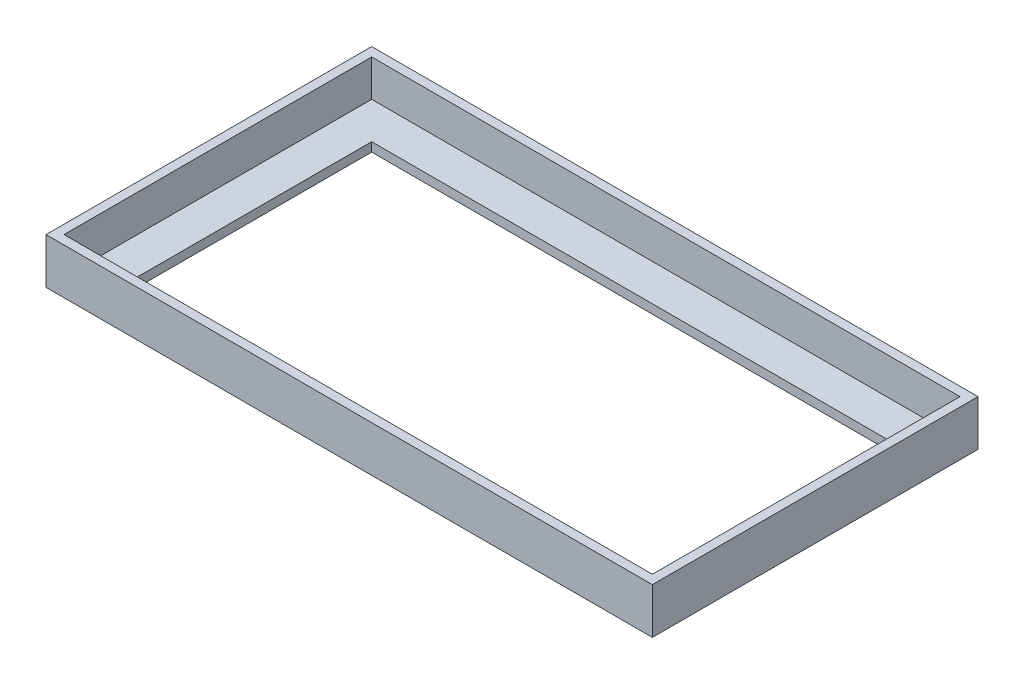
ISO-10303-21;
HEADER;
FILE_DESCRIPTION(('STEP AP214'),'2;1');
FILE_NAME('part.step','',(''),(''),'','','');
FILE_SCHEMA(('AUTOMOTIVE_DESIGN { 1 0 10303 214 1 1 1 1 }'));
ENDSEC;
DATA;
#1=APPLICATION_CONTEXT('core data for automotive mechanical design processes');
#2=APPLICATION_PROTOCOL_DEFINITION('international standard','automotive_design',2000,#1);
#3=PRODUCT_CONTEXT('',#1,'mechanical');
#4=PRODUCT('Part','Part','',(#3));
#5=PRODUCT_RELATED_PRODUCT_CATEGORY('part','',(#4));
#6=PRODUCT_DEFINITION_FORMATION('','',#4);
#7=PRODUCT_DEFINITION_CONTEXT('part definition',#1,'design');
#8=PRODUCT_DEFINITION('design','',#6,#7);
#9=PRODUCT_DEFINITION_SHAPE('','',#8);
#10=(LENGTH_UNIT() NAMED_UNIT(*) SI_UNIT(.MILLI.,.METRE.));
#11=(NAMED_UNIT(*) PLANE_ANGLE_UNIT() SI_UNIT($,.RADIAN.));
#12=(NAMED_UNIT(*) SI_UNIT($,.STERADIAN.) SOLID_ANGLE_UNIT());
#13=UNCERTAINTY_MEASURE_WITH_UNIT(LENGTH_MEASURE(1.E-05),#10,'distance_accuracy_value','');
#14=(GEOMETRIC_REPRESENTATION_CONTEXT(3) GLOBAL_UNCERTAINTY_ASSIGNED_CONTEXT((#13)) GLOBAL_UNIT_ASSIGNED_CONTEXT((#10,
#11,#12)) REPRESENTATION_CONTEXT('',''));
#15=CARTESIAN_POINT('',(0.,0.,0.));
#16=DIRECTION('',(0.,0.,1.));
#17=DIRECTION('',(1.,0.,0.));
#18=AXIS2_PLACEMENT_3D('',#15,#16,#17);
#19=CARTESIAN_POINT('',(168.5,25.4,-90.5));
#20=DIRECTION('',(-1.,0.,0.));
#21=DIRECTION('',(0.,0.,1.));
#22=AXIS2_PLACEMENT_3D('',#19,#20,#21);
#23=PLANE('',#22);
#24=DIRECTION('',(0.,0.,-1.));
#25=VECTOR('',#24,1.);
#26=CARTESIAN_POINT('',(168.5,0.,-90.5));
#27=LINE('',#26,#25);
#28=CARTESIAN_POINT('',(168.5,0.,90.5));
#29=VERTEX_POINT('',#28);
#30=CARTESIAN_POINT('',(168.5,0.,-90.5));
#31=VERTEX_POINT('',#30);
#32=EDGE_CURVE('E177',#29,#31,#27,.T.);
#33=ORIENTED_EDGE('',*,*,#32,.T.);
#34=DIRECTION('',(0.,-1.,0.));
#35=VECTOR('',#34,1.);
#36=CARTESIAN_POINT('',(168.5,25.4,-90.5));
#37=LINE('',#36,#35);
#38=CARTESIAN_POINT('',(168.5,25.4,-90.5));
#39=VERTEX_POINT('',#38);
#40=EDGE_CURVE('E248',#39,#31,#37,.T.);
#41=ORIENTED_EDGE('',*,*,#40,.F.);
#42=DIRECTION('',(0.,0.,-1.));
#43=VECTOR('',#42,1.);
#44=CARTESIAN_POINT('',(168.5,25.4,-90.5));
#45=LINE('',#44,#43);
#46=CARTESIAN_POINT('',(168.5,25.4,90.5));
#47=VERTEX_POINT('',#46);
#48=EDGE_CURVE('E211',#47,#39,#45,.T.);
#49=ORIENTED_EDGE('',*,*,#48,.F.);
#50=DIRECTION('',(0.,-1.,0.));
#51=VECTOR('',#50,1.);
#52=CARTESIAN_POINT('',(168.5,25.4,90.5));
#53=LINE('',#52,#51);
#54=EDGE_CURVE('E225',#47,#29,#53,.T.);
#55=ORIENTED_EDGE('',*,*,#54,.T.);
#56=EDGE_LOOP('',(#33,#41,#49,#55));
#57=FACE_BOUND('',#56,.T.);
#58=ADVANCED_FACE('F45',(#57),#23,.F.);
#59=CARTESIAN_POINT('',(-168.5,25.4,-90.5));
#60=DIRECTION('',(0.,0.,1.));
#61=DIRECTION('',(1.,0.,0.));
#62=AXIS2_PLACEMENT_3D('',#59,#60,#61);
#63=PLANE('',#62);
#64=DIRECTION('',(-1.,0.,0.));
#65=VECTOR('',#64,1.);
#66=CARTESIAN_POINT('',(-168.5,0.,-90.5));
#67=LINE('',#66,#65);
#68=CARTESIAN_POINT('',(-168.5,0.,-90.5));
#69=VERTEX_POINT('',#68);
#70=EDGE_CURVE('E229',#31,#69,#67,.T.);
#71=ORIENTED_EDGE('',*,*,#70,.T.);
#72=DIRECTION('',(0.,-1.,0.));
#73=VECTOR('',#72,1.);
#74=CARTESIAN_POINT('',(-168.5,25.4,-90.5));
#75=LINE('',#74,#73);
#76=CARTESIAN_POINT('',(-168.5,25.4,-90.5));
#77=VERTEX_POINT('',#76);
#78=EDGE_CURVE('E244',#77,#69,#75,.T.);
#79=ORIENTED_EDGE('',*,*,#78,.F.);
#80=DIRECTION('',(-1.,0.,0.));
#81=VECTOR('',#80,1.);
#82=CARTESIAN_POINT('',(-168.5,25.4,-90.5));
#83=LINE('',#82,#81);
#84=EDGE_CURVE('E215',#39,#77,#83,.T.);
#85=ORIENTED_EDGE('',*,*,#84,.F.);
#86=ORIENTED_EDGE('',*,*,#40,.T.);
#87=EDGE_LOOP('',(#71,#79,#85,#86));
#88=FACE_BOUND('',#87,.T.);
#89=ADVANCED_FACE('F279',(#88),#63,.F.);
#90=CARTESIAN_POINT('',(-168.5,25.4,-90.5));
#91=DIRECTION('',(1.,0.,0.));
#92=DIRECTION('',(0.,0.,-1.));
#93=AXIS2_PLACEMENT_3D('',#90,#91,#92);
#94=PLANE('',#93);
#95=DIRECTION('',(0.,0.,1.));
#96=VECTOR('',#95,1.);
#97=CARTESIAN_POINT('',(-168.5,0.,-90.5));
#98=LINE('',#97,#96);
#99=CARTESIAN_POINT('',(-168.5,0.,90.5));
#100=VERTEX_POINT('',#99);
#101=EDGE_CURVE('E232',#69,#100,#98,.T.);
#102=ORIENTED_EDGE('',*,*,#101,.T.);
#103=DIRECTION('',(0.,-1.,0.));
#104=VECTOR('',#103,1.);
#105=CARTESIAN_POINT('',(-168.5,25.4,90.5));
#106=LINE('',#105,#104);
#107=CARTESIAN_POINT('',(-168.5,25.4,90.5));
#108=VERTEX_POINT('',#107);
#109=EDGE_CURVE('E240',#108,#100,#106,.T.);
#110=ORIENTED_EDGE('',*,*,#109,.F.);
#111=DIRECTION('',(0.,0.,1.));
#112=VECTOR('',#111,1.);
#113=CARTESIAN_POINT('',(-168.5,25.4,-90.5));
#114=LINE('',#113,#112);
#115=EDGE_CURVE('E219',#77,#108,#114,.T.);
#116=ORIENTED_EDGE('',*,*,#115,.F.);
#117=ORIENTED_EDGE('',*,*,#78,.T.);
#118=EDGE_LOOP('',(#102,#110,#116,#117));
#119=FACE_BOUND('',#118,.T.);
#120=ADVANCED_FACE('F284',(#119),#94,.F.);
#121=CARTESIAN_POINT('',(-168.5,25.4,90.5));
#122=DIRECTION('',(0.,0.,-1.));
#123=DIRECTION('',(-1.,0.,0.));
#124=AXIS2_PLACEMENT_3D('',#121,#122,#123);
#125=PLANE('',#124);
#126=DIRECTION('',(1.,0.,0.));
#127=VECTOR('',#126,1.);
#128=CARTESIAN_POINT('',(-168.5,0.,90.5));
#129=LINE('',#128,#127);
#130=EDGE_CURVE('E216',#100,#29,#129,.T.);
#131=ORIENTED_EDGE('',*,*,#130,.T.);
#132=ORIENTED_EDGE('',*,*,#54,.F.);
#133=DIRECTION('',(1.,0.,0.));
#134=VECTOR('',#133,1.);
#135=CARTESIAN_POINT('',(-168.5,25.4,90.5));
#136=LINE('',#135,#134);
#137=EDGE_CURVE('E222',#108,#47,#136,.T.);
#138=ORIENTED_EDGE('',*,*,#137,.F.);
#139=ORIENTED_EDGE('',*,*,#109,.T.);
#140=EDGE_LOOP('',(#131,#132,#138,#139));
#141=FACE_BOUND('',#140,.T.);
#142=ADVANCED_FACE('F299',(#141),#125,.F.);
#143=CARTESIAN_POINT('',(0.,25.4,0.));
#144=DIRECTION('',(0.,1.,0.));
#145=DIRECTION('',(0.,0.,1.));
#146=AXIS2_PLACEMENT_3D('',#143,#144,#145);
#147=PLANE('',#146);
#148=DIRECTION('',(0.,0.,-1.));
#149=VECTOR('',#148,1.);
#150=CARTESIAN_POINT('',(163.5,25.4,-90.5));
#151=LINE('',#150,#149);
#152=CARTESIAN_POINT('',(163.5,25.4,85.5));
#153=VERTEX_POINT('',#152);
#154=CARTESIAN_POINT('',(163.5,25.4,-85.5));
#155=VERTEX_POINT('',#154);
#156=EDGE_CURVE('E199',#153,#155,#151,.T.);
#157=ORIENTED_EDGE('',*,*,#156,.F.);
#158=DIRECTION('',(1.,0.,0.));
#159=VECTOR('',#158,1.);
#160=CARTESIAN_POINT('',(-168.5,25.4,85.5));
#161=LINE('',#160,#159);
#162=CARTESIAN_POINT('',(-163.5,25.4,85.5));
#163=VERTEX_POINT('',#162);
#164=EDGE_CURVE('E184',#163,#153,#161,.T.);
#165=ORIENTED_EDGE('',*,*,#164,.F.);
#166=DIRECTION('',(0.,0.,1.));
#167=VECTOR('',#166,1.);
#168=CARTESIAN_POINT('',(-163.5,25.4,-90.5));
#169=LINE('',#168,#167);
#170=CARTESIAN_POINT('',(-163.5,25.4,-85.5));
#171=VERTEX_POINT('',#170);
#172=EDGE_CURVE('E205',#171,#163,#169,.T.);
#173=ORIENTED_EDGE('',*,*,#172,.F.);
#174=DIRECTION('',(-1.,0.,0.));
#175=VECTOR('',#174,1.);
#176=CARTESIAN_POINT('',(-168.5,25.4,-85.5));
#177=LINE('',#176,#175);
#178=EDGE_CURVE('E202',#155,#171,#177,.T.);
#179=ORIENTED_EDGE('',*,*,#178,.F.);
#180=EDGE_LOOP('',(#157,#165,#173,#179));
#181=FACE_BOUND('',#180,.T.);
#182=ORIENTED_EDGE('',*,*,#48,.T.);
#183=ORIENTED_EDGE('',*,*,#84,.T.);
#184=ORIENTED_EDGE('',*,*,#115,.T.);
#185=ORIENTED_EDGE('',*,*,#137,.T.);
#186=EDGE_LOOP('',(#182,#183,#184,#185));
#187=FACE_BOUND('',#186,.T.);
#188=ADVANCED_FACE('F295',(#181,#187),#147,.T.);
#189=CARTESIAN_POINT('',(0.,0.,0.));
#190=DIRECTION('',(0.,1.,0.));
#191=DIRECTION('',(0.,0.,1.));
#192=AXIS2_PLACEMENT_3D('',#189,#190,#191);
#193=PLANE('',#192);
#194=DIRECTION('',(-1.,0.,0.));
#195=VECTOR('',#194,1.);
#196=CARTESIAN_POINT('',(-143.1,0.,65.1));
#197=LINE('',#196,#195);
#198=CARTESIAN_POINT('',(143.1,0.,65.1));
#199=VERTEX_POINT('',#198);
#200=CARTESIAN_POINT('',(-143.1,0.,65.1));
#201=VERTEX_POINT('',#200);
#202=EDGE_CURVE('E146',#199,#201,#197,.T.);
#203=ORIENTED_EDGE('',*,*,#202,.F.);
#204=DIRECTION('',(0.,0.,1.));
#205=VECTOR('',#204,1.);
#206=CARTESIAN_POINT('',(143.1,0.,65.1));
#207=LINE('',#206,#205);
#208=CARTESIAN_POINT('',(143.1,0.,-65.1));
#209=VERTEX_POINT('',#208);
#210=EDGE_CURVE('E60',#209,#199,#207,.T.);
#211=ORIENTED_EDGE('',*,*,#210,.F.);
#212=DIRECTION('',(1.,0.,0.));
#213=VECTOR('',#212,1.);
#214=CARTESIAN_POINT('',(-143.1,0.,-65.1));
#215=LINE('',#214,#213);
#216=CARTESIAN_POINT('',(-143.1,0.,-65.1));
#217=VERTEX_POINT('',#216);
#218=EDGE_CURVE('E154',#217,#209,#215,.T.);
#219=ORIENTED_EDGE('',*,*,#218,.F.);
#220=DIRECTION('',(0.,0.,-1.));
#221=VECTOR('',#220,1.);
#222=CARTESIAN_POINT('',(-143.1,0.,65.1));
#223=LINE('',#222,#221);
#224=EDGE_CURVE('E136',#201,#217,#223,.T.);
#225=ORIENTED_EDGE('',*,*,#224,.F.);
#226=EDGE_LOOP('',(#203,#211,#219,#225));
#227=FACE_BOUND('',#226,.T.);
#228=ORIENTED_EDGE('',*,*,#32,.F.);
#229=ORIENTED_EDGE('',*,*,#130,.F.);
#230=ORIENTED_EDGE('',*,*,#101,.F.);
#231=ORIENTED_EDGE('',*,*,#70,.F.);
#232=EDGE_LOOP('',(#228,#229,#230,#231));
#233=FACE_BOUND('',#232,.T.);
#234=ADVANCED_FACE('F151',(#227,#233),#193,.F.);
#235=CARTESIAN_POINT('',(163.5,25.4,-90.5));
#236=DIRECTION('',(-1.,0.,0.));
#237=DIRECTION('',(0.,0.,1.));
#238=AXIS2_PLACEMENT_3D('',#235,#236,#237);
#239=PLANE('',#238);
#240=DIRECTION('',(0.,0.,-1.));
#241=VECTOR('',#240,1.);
#242=CARTESIAN_POINT('',(163.5,5.,-90.5));
#243=LINE('',#242,#241);
#244=CARTESIAN_POINT('',(163.5,5.,85.5));
#245=VERTEX_POINT('',#244);
#246=CARTESIAN_POINT('',(163.5,5.,-85.5));
#247=VERTEX_POINT('',#246);
#248=EDGE_CURVE('E164',#245,#247,#243,.T.);
#249=ORIENTED_EDGE('',*,*,#248,.F.);
#250=DIRECTION('',(0.,-1.,0.));
#251=VECTOR('',#250,1.);
#252=CARTESIAN_POINT('',(163.5,25.4,85.5));
#253=LINE('',#252,#251);
#254=EDGE_CURVE('E179',#153,#245,#253,.T.);
#255=ORIENTED_EDGE('',*,*,#254,.F.);
#256=ORIENTED_EDGE('',*,*,#156,.T.);
#257=DIRECTION('',(0.,-1.,0.));
#258=VECTOR('',#257,1.);
#259=CARTESIAN_POINT('',(163.5,25.4,-85.5));
#260=LINE('',#259,#258);
#261=EDGE_CURVE('E173',#155,#247,#260,.T.);
#262=ORIENTED_EDGE('',*,*,#261,.T.);
#263=EDGE_LOOP('',(#249,#255,#256,#262));
#264=FACE_BOUND('',#263,.T.);
#265=ADVANCED_FACE('F310',(#264),#239,.T.);
#266=CARTESIAN_POINT('',(-168.5,25.4,-85.5));
#267=DIRECTION('',(0.,0.,1.));
#268=DIRECTION('',(1.,0.,0.));
#269=AXIS2_PLACEMENT_3D('',#266,#267,#268);
#270=PLANE('',#269);
#271=DIRECTION('',(-1.,0.,0.));
#272=VECTOR('',#271,1.);
#273=CARTESIAN_POINT('',(-168.5,5.,-85.5));
#274=LINE('',#273,#272);
#275=CARTESIAN_POINT('',(-163.5,5.,-85.5));
#276=VERTEX_POINT('',#275);
#277=EDGE_CURVE('E172',#247,#276,#274,.T.);
#278=ORIENTED_EDGE('',*,*,#277,.F.);
#279=ORIENTED_EDGE('',*,*,#261,.F.);
#280=ORIENTED_EDGE('',*,*,#178,.T.);
#281=DIRECTION('',(0.,-1.,0.));
#282=VECTOR('',#281,1.);
#283=CARTESIAN_POINT('',(-163.5,25.4,-85.5));
#284=LINE('',#283,#282);
#285=EDGE_CURVE('E178',#171,#276,#284,.T.);
#286=ORIENTED_EDGE('',*,*,#285,.T.);
#287=EDGE_LOOP('',(#278,#279,#280,#286));
#288=FACE_BOUND('',#287,.T.);
#289=ADVANCED_FACE('F320',(#288),#270,.T.);
#290=CARTESIAN_POINT('',(-163.5,25.4,-90.5));
#291=DIRECTION('',(1.,0.,0.));
#292=DIRECTION('',(0.,0.,-1.));
#293=AXIS2_PLACEMENT_3D('',#290,#291,#292);
#294=PLANE('',#293);
#295=DIRECTION('',(0.,0.,1.));
#296=VECTOR('',#295,1.);
#297=CARTESIAN_POINT('',(-163.5,5.,-90.5));
#298=LINE('',#297,#296);
#299=CARTESIAN_POINT('',(-163.5,5.,85.5));
#300=VERTEX_POINT('',#299);
#301=EDGE_CURVE('E187',#276,#300,#298,.T.);
#302=ORIENTED_EDGE('',*,*,#301,.F.);
#303=ORIENTED_EDGE('',*,*,#285,.F.);
#304=ORIENTED_EDGE('',*,*,#172,.T.);
#305=DIRECTION('',(0.,-1.,0.));
#306=VECTOR('',#305,1.);
#307=CARTESIAN_POINT('',(-163.5,25.4,85.5));
#308=LINE('',#307,#306);
#309=EDGE_CURVE('E183',#163,#300,#308,.T.);
#310=ORIENTED_EDGE('',*,*,#309,.T.);
#311=EDGE_LOOP('',(#302,#303,#304,#310));
#312=FACE_BOUND('',#311,.T.);
#313=ADVANCED_FACE('F316',(#312),#294,.T.);
#314=CARTESIAN_POINT('',(-168.5,25.4,85.5));
#315=DIRECTION('',(0.,0.,-1.));
#316=DIRECTION('',(-1.,0.,0.));
#317=AXIS2_PLACEMENT_3D('',#314,#315,#316);
#318=PLANE('',#317);
#319=DIRECTION('',(1.,0.,0.));
#320=VECTOR('',#319,1.);
#321=CARTESIAN_POINT('',(-168.5,5.,85.5));
#322=LINE('',#321,#320);
#323=EDGE_CURVE('E193',#300,#245,#322,.T.);
#324=ORIENTED_EDGE('',*,*,#323,.F.);
#325=ORIENTED_EDGE('',*,*,#309,.F.);
#326=ORIENTED_EDGE('',*,*,#164,.T.);
#327=ORIENTED_EDGE('',*,*,#254,.T.);
#328=EDGE_LOOP('',(#324,#325,#326,#327));
#329=FACE_BOUND('',#328,.T.);
#330=ADVANCED_FACE('F274',(#329),#318,.T.);
#331=CARTESIAN_POINT('',(0.,5.,0.));
#332=DIRECTION('',(0.,1.,0.));
#333=DIRECTION('',(0.,0.,1.));
#334=AXIS2_PLACEMENT_3D('',#331,#332,#333);
#335=PLANE('',#334);
#336=DIRECTION('',(0.,0.,-1.));
#337=VECTOR('',#336,1.);
#338=CARTESIAN_POINT('',(143.1,5.,0.));
#339=LINE('',#338,#337);
#340=CARTESIAN_POINT('',(143.1,5.,65.1));
#341=VERTEX_POINT('',#340);
#342=CARTESIAN_POINT('',(143.1,5.,-65.1));
#343=VERTEX_POINT('',#342);
#344=EDGE_CURVE('E11',#341,#343,#339,.T.);
#345=ORIENTED_EDGE('',*,*,#344,.F.);
#346=DIRECTION('',(1.,0.,0.));
#347=VECTOR('',#346,1.);
#348=CARTESIAN_POINT('',(0.,5.,65.1));
#349=LINE('',#348,#347);
#350=CARTESIAN_POINT('',(-143.1,5.,65.1));
#351=VERTEX_POINT('',#350);
#352=EDGE_CURVE('E252',#351,#341,#349,.T.);
#353=ORIENTED_EDGE('',*,*,#352,.F.);
#354=DIRECTION('',(0.,0.,1.));
#355=VECTOR('',#354,1.);
#356=CARTESIAN_POINT('',(-143.1,5.,0.));
#357=LINE('',#356,#355);
#358=CARTESIAN_POINT('',(-143.1,5.,-65.1));
#359=VERTEX_POINT('',#358);
#360=EDGE_CURVE('E139',#359,#351,#357,.T.);
#361=ORIENTED_EDGE('',*,*,#360,.F.);
#362=DIRECTION('',(-1.,0.,0.));
#363=VECTOR('',#362,1.);
#364=CARTESIAN_POINT('',(0.,5.,-65.1));
#365=LINE('',#364,#363);
#366=EDGE_CURVE('E53',#343,#359,#365,.T.);
#367=ORIENTED_EDGE('',*,*,#366,.F.);
#368=EDGE_LOOP('',(#345,#353,#361,#367));
#369=FACE_BOUND('',#368,.T.);
#370=ORIENTED_EDGE('',*,*,#248,.T.);
#371=ORIENTED_EDGE('',*,*,#277,.T.);
#372=ORIENTED_EDGE('',*,*,#301,.T.);
#373=ORIENTED_EDGE('',*,*,#323,.T.);
#374=EDGE_LOOP('',(#370,#371,#372,#373));
#375=FACE_BOUND('',#374,.T.);
#376=ADVANCED_FACE('F263',(#369,#375),#335,.T.);
#377=CARTESIAN_POINT('',(143.1,25.4,65.1));
#378=DIRECTION('',(1.,0.,0.));
#379=DIRECTION('',(0.,0.,-1.));
#380=AXIS2_PLACEMENT_3D('',#377,#378,#379);
#381=PLANE('',#380);
#382=ORIENTED_EDGE('',*,*,#344,.T.);
#383=DIRECTION('',(0.,-1.,0.));
#384=VECTOR('',#383,1.);
#385=CARTESIAN_POINT('',(143.1,25.4,-65.1));
#386=LINE('',#385,#384);
#387=EDGE_CURVE('E161',#343,#209,#386,.T.);
#388=ORIENTED_EDGE('',*,*,#387,.T.);
#389=ORIENTED_EDGE('',*,*,#210,.T.);
#390=DIRECTION('',(0.,-1.,0.));
#391=VECTOR('',#390,1.);
#392=CARTESIAN_POINT('',(143.1,25.4,65.1));
#393=LINE('',#392,#391);
#394=EDGE_CURVE('E143',#341,#199,#393,.T.);
#395=ORIENTED_EDGE('',*,*,#394,.F.);
#396=EDGE_LOOP('',(#382,#388,#389,#395));
#397=FACE_BOUND('',#396,.T.);
#398=ADVANCED_FACE('F265',(#397),#381,.F.);
#399=CARTESIAN_POINT('',(-143.1,25.4,-65.1));
#400=DIRECTION('',(0.,0.,-1.));
#401=DIRECTION('',(-1.,0.,0.));
#402=AXIS2_PLACEMENT_3D('',#399,#400,#401);
#403=PLANE('',#402);
#404=ORIENTED_EDGE('',*,*,#366,.T.);
#405=DIRECTION('',(0.,-1.,0.));
#406=VECTOR('',#405,1.);
#407=CARTESIAN_POINT('',(-143.1,25.4,-65.1));
#408=LINE('',#407,#406);
#409=EDGE_CURVE('E142',#359,#217,#408,.T.);
#410=ORIENTED_EDGE('',*,*,#409,.T.);
#411=ORIENTED_EDGE('',*,*,#218,.T.);
#412=ORIENTED_EDGE('',*,*,#387,.F.);
#413=EDGE_LOOP('',(#404,#410,#411,#412));
#414=FACE_BOUND('',#413,.T.);
#415=ADVANCED_FACE('F260',(#414),#403,.F.);
#416=CARTESIAN_POINT('',(-143.1,25.4,65.1));
#417=DIRECTION('',(-1.,0.,0.));
#418=DIRECTION('',(0.,0.,1.));
#419=AXIS2_PLACEMENT_3D('',#416,#417,#418);
#420=PLANE('',#419);
#421=ORIENTED_EDGE('',*,*,#360,.T.);
#422=DIRECTION('',(0.,-1.,0.));
#423=VECTOR('',#422,1.);
#424=CARTESIAN_POINT('',(-143.1,25.4,65.1));
#425=LINE('',#424,#423);
#426=EDGE_CURVE('E68',#351,#201,#425,.T.);
#427=ORIENTED_EDGE('',*,*,#426,.T.);
#428=ORIENTED_EDGE('',*,*,#224,.T.);
#429=ORIENTED_EDGE('',*,*,#409,.F.);
#430=EDGE_LOOP('',(#421,#427,#428,#429));
#431=FACE_BOUND('',#430,.T.);
#432=ADVANCED_FACE('F133',(#431),#420,.F.);
#433=CARTESIAN_POINT('',(-143.1,25.4,65.1));
#434=DIRECTION('',(0.,0.,1.));
#435=DIRECTION('',(1.,0.,0.));
#436=AXIS2_PLACEMENT_3D('',#433,#434,#435);
#437=PLANE('',#436);
#438=ORIENTED_EDGE('',*,*,#352,.T.);
#439=ORIENTED_EDGE('',*,*,#394,.T.);
#440=ORIENTED_EDGE('',*,*,#202,.T.);
#441=ORIENTED_EDGE('',*,*,#426,.F.);
#442=EDGE_LOOP('',(#438,#439,#440,#441));
#443=FACE_BOUND('',#442,.T.);
#444=ADVANCED_FACE('F147',(#443),#437,.F.);
#445=CLOSED_SHELL('',(#58,#89,#120,#142,#188,#234,#265,#289,#313,#330,#376,#398,#415,#432,#444));
#446=MANIFOLD_SOLID_BREP('B2',#445);
#447=ADVANCED_BREP_SHAPE_REPRESENTATION('',(#18,#446),#14);
#448=SHAPE_DEFINITION_REPRESENTATION(#9,#447);
ENDSEC;
END-ISO-10303-21;
